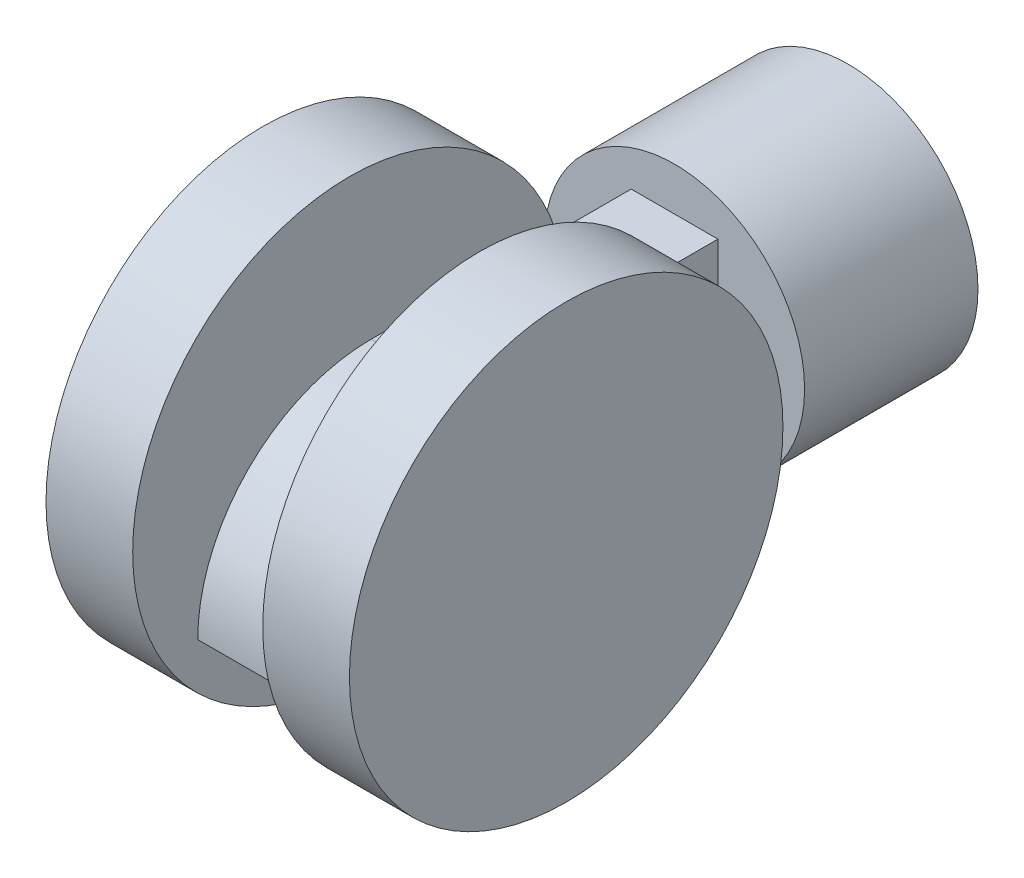
ISO-10303-21;
HEADER;
FILE_DESCRIPTION(('STEP AP214'),'2;1');
FILE_NAME('part.step','',(''),(''),'','','');
FILE_SCHEMA(('AUTOMOTIVE_DESIGN { 1 0 10303 214 1 1 1 1 }'));
ENDSEC;
DATA;
#1=APPLICATION_CONTEXT('core data for automotive mechanical design processes');
#2=APPLICATION_PROTOCOL_DEFINITION('international standard','automotive_design',2000,#1);
#3=PRODUCT_CONTEXT('',#1,'mechanical');
#4=PRODUCT('Part','Part','',(#3));
#5=PRODUCT_RELATED_PRODUCT_CATEGORY('part','',(#4));
#6=PRODUCT_DEFINITION_FORMATION('','',#4);
#7=PRODUCT_DEFINITION_CONTEXT('part definition',#1,'design');
#8=PRODUCT_DEFINITION('design','',#6,#7);
#9=PRODUCT_DEFINITION_SHAPE('','',#8);
#10=(LENGTH_UNIT() NAMED_UNIT(*) SI_UNIT(.MILLI.,.METRE.));
#11=(NAMED_UNIT(*) PLANE_ANGLE_UNIT() SI_UNIT($,.RADIAN.));
#12=(NAMED_UNIT(*) SI_UNIT($,.STERADIAN.) SOLID_ANGLE_UNIT());
#13=UNCERTAINTY_MEASURE_WITH_UNIT(LENGTH_MEASURE(1.E-05),#10,'distance_accuracy_value','');
#14=(GEOMETRIC_REPRESENTATION_CONTEXT(3) GLOBAL_UNCERTAINTY_ASSIGNED_CONTEXT((#13)) GLOBAL_UNIT_ASSIGNED_CONTEXT((#10,
#11,#12)) REPRESENTATION_CONTEXT('',''));
#15=CARTESIAN_POINT('',(0.,0.,0.));
#16=DIRECTION('',(0.,0.,1.));
#17=DIRECTION('',(1.,0.,0.));
#18=AXIS2_PLACEMENT_3D('',#15,#16,#17);
#19=CARTESIAN_POINT('',(1.,0.,14.));
#20=DIRECTION('',(-1.,0.,0.));
#21=DIRECTION('',(0.,0.,1.));
#22=AXIS2_PLACEMENT_3D('',#19,#20,#21);
#23=PLANE('',#22);
#24=DIRECTION('',(0.,0.,-1.));
#25=VECTOR('',#24,1.);
#26=CARTESIAN_POINT('',(1.,2.,14.));
#27=LINE('',#26,#25);
#28=CARTESIAN_POINT('',(1.,2.,10.));
#29=VERTEX_POINT('',#28);
#30=CARTESIAN_POINT('',(1.,2.,4.));
#31=VERTEX_POINT('',#30);
#32=EDGE_CURVE('E104',#29,#31,#27,.T.);
#33=ORIENTED_EDGE('',*,*,#32,.F.);
#34=CARTESIAN_POINT('',(1.,-2.,10.));
#35=DIRECTION('',(-1.,0.,0.));
#36=DIRECTION('',(0.,0.,1.));
#37=AXIS2_PLACEMENT_3D('',#34,#35,#36);
#38=CIRCLE('',#37,4.);
#39=CARTESIAN_POINT('',(1.,-2.,14.));
#40=VERTEX_POINT('',#39);
#41=EDGE_CURVE('E11',#29,#40,#38,.F.);
#42=ORIENTED_EDGE('',*,*,#41,.T.);
#43=DIRECTION('',(0.,0.,-1.));
#44=VECTOR('',#43,1.);
#45=CARTESIAN_POINT('',(1.,-2.,14.));
#46=LINE('',#45,#44);
#47=CARTESIAN_POINT('',(1.,-2.,4.));
#48=VERTEX_POINT('',#47);
#49=EDGE_CURVE('E90',#40,#48,#46,.T.);
#50=ORIENTED_EDGE('',*,*,#49,.T.);
#51=DIRECTION('',(0.,-1.,0.));
#52=VECTOR('',#51,1.);
#53=CARTESIAN_POINT('',(1.,0.,4.));
#54=LINE('',#53,#52);
#55=EDGE_CURVE('E112',#31,#48,#54,.T.);
#56=ORIENTED_EDGE('',*,*,#55,.F.);
#57=EDGE_LOOP('',(#33,#42,#50,#56));
#58=FACE_BOUND('',#57,.T.);
#59=CARTESIAN_POINT('',(1.,0.,10.));
#60=DIRECTION('',(-1.,0.,0.));
#61=DIRECTION('',(0.,0.,1.));
#62=AXIS2_PLACEMENT_3D('',#59,#60,#61);
#63=CIRCLE('',#62,1.);
#64=CARTESIAN_POINT('',(1.,0.,11.));
#65=VERTEX_POINT('',#64);
#66=EDGE_CURVE('E79',#65,#65,#63,.F.);
#67=ORIENTED_EDGE('',*,*,#66,.F.);
#68=EDGE_LOOP('',(#67));
#69=FACE_BOUND('',#68,.T.);
#70=ADVANCED_FACE('F38',(#58,#69),#23,.F.);
#71=CARTESIAN_POINT('',(-1.,2.,14.));
#72=DIRECTION('',(1.,0.,0.));
#73=DIRECTION('',(0.,1.,0.));
#74=AXIS2_PLACEMENT_3D('',#71,#72,#73);
#75=PLANE('',#74);
#76=DIRECTION('',(0.,0.,-1.));
#77=VECTOR('',#76,1.);
#78=CARTESIAN_POINT('',(-1.,-2.,14.));
#79=LINE('',#78,#77);
#80=CARTESIAN_POINT('',(-1.,-2.,14.));
#81=VERTEX_POINT('',#80);
#82=CARTESIAN_POINT('',(-1.,-2.,4.));
#83=VERTEX_POINT('',#82);
#84=EDGE_CURVE('E82',#81,#83,#79,.T.);
#85=ORIENTED_EDGE('',*,*,#84,.F.);
#86=CARTESIAN_POINT('',(-1.,-2.,10.));
#87=DIRECTION('',(1.,0.,0.));
#88=DIRECTION('',(0.,1.,0.));
#89=AXIS2_PLACEMENT_3D('',#86,#87,#88);
#90=CIRCLE('',#89,4.);
#91=CARTESIAN_POINT('',(-1.,2.,10.));
#92=VERTEX_POINT('',#91);
#93=EDGE_CURVE('E60',#81,#92,#90,.F.);
#94=ORIENTED_EDGE('',*,*,#93,.T.);
#95=DIRECTION('',(0.,0.,-1.));
#96=VECTOR('',#95,1.);
#97=CARTESIAN_POINT('',(-1.,2.,14.));
#98=LINE('',#97,#96);
#99=CARTESIAN_POINT('',(-1.,2.,4.));
#100=VERTEX_POINT('',#99);
#101=EDGE_CURVE('E89',#92,#100,#98,.T.);
#102=ORIENTED_EDGE('',*,*,#101,.T.);
#103=DIRECTION('',(0.,1.,0.));
#104=VECTOR('',#103,1.);
#105=CARTESIAN_POINT('',(-1.,0.,4.));
#106=LINE('',#105,#104);
#107=EDGE_CURVE('E86',#83,#100,#106,.T.);
#108=ORIENTED_EDGE('',*,*,#107,.F.);
#109=EDGE_LOOP('',(#85,#94,#102,#108));
#110=FACE_BOUND('',#109,.T.);
#111=CARTESIAN_POINT('',(-1.,0.,10.));
#112=DIRECTION('',(1.,0.,0.));
#113=DIRECTION('',(0.,1.,0.));
#114=AXIS2_PLACEMENT_3D('',#111,#112,#113);
#115=CIRCLE('',#114,1.);
#116=CARTESIAN_POINT('',(-1.,0.999999999999999,10.));
#117=VERTEX_POINT('',#116);
#118=EDGE_CURVE('E119',#117,#117,#115,.F.);
#119=ORIENTED_EDGE('',*,*,#118,.F.);
#120=EDGE_LOOP('',(#119));
#121=FACE_BOUND('',#120,.T.);
#122=ADVANCED_FACE('F83',(#110,#121),#75,.F.);
#123=CARTESIAN_POINT('',(0.,0.,4.));
#124=DIRECTION('',(0.,0.,1.));
#125=DIRECTION('',(1.,0.,0.));
#126=AXIS2_PLACEMENT_3D('',#123,#124,#125);
#127=PLANE('',#126);
#128=CARTESIAN_POINT('',(0.,0.,4.));
#129=DIRECTION('',(0.,0.,1.));
#130=DIRECTION('',(1.,0.,0.));
#131=AXIS2_PLACEMENT_3D('',#128,#129,#130);
#132=CIRCLE('',#131,3.);
#133=CARTESIAN_POINT('',(3.,0.,4.));
#134=VERTEX_POINT('',#133);
#135=EDGE_CURVE('E116',#134,#134,#132,.T.);
#136=ORIENTED_EDGE('',*,*,#135,.T.);
#137=EDGE_LOOP('',(#136));
#138=FACE_BOUND('',#137,.T.);
#139=DIRECTION('',(1.,0.,0.));
#140=VECTOR('',#139,1.);
#141=CARTESIAN_POINT('',(0.,2.,4.));
#142=LINE('',#141,#140);
#143=EDGE_CURVE('E109',#100,#31,#142,.T.);
#144=ORIENTED_EDGE('',*,*,#143,.T.);
#145=ORIENTED_EDGE('',*,*,#55,.T.);
#146=DIRECTION('',(-1.,0.,0.));
#147=VECTOR('',#146,1.);
#148=CARTESIAN_POINT('',(0.,-2.,4.));
#149=LINE('',#148,#147);
#150=EDGE_CURVE('E106',#48,#83,#149,.T.);
#151=ORIENTED_EDGE('',*,*,#150,.T.);
#152=ORIENTED_EDGE('',*,*,#107,.T.);
#153=EDGE_LOOP('',(#144,#145,#151,#152));
#154=FACE_BOUND('',#153,.T.);
#155=ADVANCED_FACE('F136',(#138,#154),#127,.T.);
#156=CARTESIAN_POINT('',(0.,0.,4.));
#157=DIRECTION('',(0.,0.,-1.));
#158=DIRECTION('',(-1.,0.,0.));
#159=AXIS2_PLACEMENT_3D('',#156,#157,#158);
#160=CYLINDRICAL_SURFACE('',#159,3.);
#161=ORIENTED_EDGE('',*,*,#135,.F.);
#162=EDGE_LOOP('',(#161));
#163=FACE_BOUND('',#162,.T.);
#164=CARTESIAN_POINT('',(0.,0.,0.));
#165=DIRECTION('',(0.,0.,1.));
#166=DIRECTION('',(1.,0.,0.));
#167=AXIS2_PLACEMENT_3D('',#164,#165,#166);
#168=CIRCLE('',#167,3.);
#169=CARTESIAN_POINT('',(3.,0.,0.));
#170=VERTEX_POINT('',#169);
#171=EDGE_CURVE('E115',#170,#170,#168,.T.);
#172=ORIENTED_EDGE('',*,*,#171,.T.);
#173=EDGE_LOOP('',(#172));
#174=FACE_BOUND('',#173,.T.);
#175=ADVANCED_FACE('F143',(#163,#174),#160,.T.);
#176=CARTESIAN_POINT('',(0.,0.,0.));
#177=DIRECTION('',(0.,0.,1.));
#178=DIRECTION('',(1.,0.,0.));
#179=AXIS2_PLACEMENT_3D('',#176,#177,#178);
#180=PLANE('',#179);
#181=ORIENTED_EDGE('',*,*,#171,.F.);
#182=EDGE_LOOP('',(#181));
#183=FACE_BOUND('',#182,.T.);
#184=ADVANCED_FACE('F145',(#183),#180,.F.);
#185=CARTESIAN_POINT('',(1.,2.,14.));
#186=DIRECTION('',(0.,-1.,0.));
#187=DIRECTION('',(1.,0.,0.));
#188=AXIS2_PLACEMENT_3D('',#185,#186,#187);
#189=PLANE('',#188);
#190=ORIENTED_EDGE('',*,*,#101,.F.);
#191=DIRECTION('',(-1.,0.,0.));
#192=VECTOR('',#191,1.);
#193=CARTESIAN_POINT('',(1.,2.,10.));
#194=LINE('',#193,#192);
#195=EDGE_CURVE('E46',#92,#29,#194,.F.);
#196=ORIENTED_EDGE('',*,*,#195,.T.);
#197=ORIENTED_EDGE('',*,*,#32,.T.);
#198=ORIENTED_EDGE('',*,*,#143,.F.);
#199=EDGE_LOOP('',(#190,#196,#197,#198));
#200=FACE_BOUND('',#199,.T.);
#201=ADVANCED_FACE('F140',(#200),#189,.F.);
#202=CARTESIAN_POINT('',(-1.,-2.,14.));
#203=DIRECTION('',(0.,1.,0.));
#204=DIRECTION('',(0.,0.,1.));
#205=AXIS2_PLACEMENT_3D('',#202,#203,#204);
#206=PLANE('',#205);
#207=ORIENTED_EDGE('',*,*,#150,.F.);
#208=ORIENTED_EDGE('',*,*,#49,.F.);
#209=DIRECTION('',(1.,0.,0.));
#210=VECTOR('',#209,1.);
#211=CARTESIAN_POINT('',(-1.,-2.,14.));
#212=LINE('',#211,#210);
#213=EDGE_CURVE('E78',#81,#40,#212,.T.);
#214=ORIENTED_EDGE('',*,*,#213,.F.);
#215=ORIENTED_EDGE('',*,*,#84,.T.);
#216=EDGE_LOOP('',(#207,#208,#214,#215));
#217=FACE_BOUND('',#216,.T.);
#218=ADVANCED_FACE('F93',(#217),#206,.F.);
#219=CARTESIAN_POINT('',(1.5,0.,10.));
#220=DIRECTION('',(-1.,0.,0.));
#221=DIRECTION('',(0.,0.,1.));
#222=AXIS2_PLACEMENT_3D('',#219,#220,#221);
#223=CYLINDRICAL_SURFACE('',#222,1.);
#224=CARTESIAN_POINT('',(-1.5,0.,10.));
#225=DIRECTION('',(-1.,0.,0.));
#226=DIRECTION('',(0.,0.,1.));
#227=AXIS2_PLACEMENT_3D('',#224,#225,#226);
#228=CIRCLE('',#227,1.);
#229=CARTESIAN_POINT('',(-1.5,0.,11.));
#230=VERTEX_POINT('',#229);
#231=EDGE_CURVE('E99',#230,#230,#228,.T.);
#232=ORIENTED_EDGE('',*,*,#231,.F.);
#233=EDGE_LOOP('',(#232));
#234=FACE_BOUND('',#233,.T.);
#235=ORIENTED_EDGE('',*,*,#118,.T.);
#236=EDGE_LOOP('',(#235));
#237=FACE_BOUND('',#236,.T.);
#238=ADVANCED_FACE('F162',(#234,#237),#223,.T.);
#239=CARTESIAN_POINT('',(1.5,0.,10.));
#240=DIRECTION('',(1.,0.,0.));
#241=DIRECTION('',(0.,0.,-1.));
#242=AXIS2_PLACEMENT_3D('',#239,#240,#241);
#243=CIRCLE('',#242,1.);
#244=CARTESIAN_POINT('',(1.5,0.,9.));
#245=VERTEX_POINT('',#244);
#246=EDGE_CURVE('E95',#245,#245,#243,.T.);
#247=ORIENTED_EDGE('',*,*,#246,.F.);
#248=EDGE_LOOP('',(#247));
#249=FACE_BOUND('',#248,.T.);
#250=ORIENTED_EDGE('',*,*,#66,.T.);
#251=EDGE_LOOP('',(#250));
#252=FACE_BOUND('',#251,.T.);
#253=ADVANCED_FACE('F128',(#249,#252),#223,.T.);
#254=CARTESIAN_POINT('',(-1.5,0.,10.));
#255=DIRECTION('',(-1.,0.,0.));
#256=DIRECTION('',(0.,0.,1.));
#257=AXIS2_PLACEMENT_3D('',#254,#255,#256);
#258=PLANE('',#257);
#259=CARTESIAN_POINT('',(-1.5,0.,10.));
#260=DIRECTION('',(-1.,0.,0.));
#261=DIRECTION('',(0.,0.,1.));
#262=AXIS2_PLACEMENT_3D('',#259,#260,#261);
#263=CIRCLE('',#262,5.);
#264=CARTESIAN_POINT('',(-1.5,0.,15.));
#265=VERTEX_POINT('',#264);
#266=EDGE_CURVE('E201',#265,#265,#263,.T.);
#267=ORIENTED_EDGE('',*,*,#266,.F.);
#268=EDGE_LOOP('',(#267));
#269=FACE_BOUND('',#268,.T.);
#270=ORIENTED_EDGE('',*,*,#231,.T.);
#271=EDGE_LOOP('',(#270));
#272=FACE_BOUND('',#271,.T.);
#273=ADVANCED_FACE('F171',(#269,#272),#258,.F.);
#274=CARTESIAN_POINT('',(-3.5,0.,10.));
#275=DIRECTION('',(1.,0.,0.));
#276=DIRECTION('',(0.,0.,-1.));
#277=AXIS2_PLACEMENT_3D('',#274,#275,#276);
#278=CYLINDRICAL_SURFACE('',#277,5.);
#279=CARTESIAN_POINT('',(-3.5,0.,10.));
#280=DIRECTION('',(-1.,0.,0.));
#281=DIRECTION('',(0.,0.,1.));
#282=AXIS2_PLACEMENT_3D('',#279,#280,#281);
#283=CIRCLE('',#282,5.);
#284=CARTESIAN_POINT('',(-3.5,0.,15.));
#285=VERTEX_POINT('',#284);
#286=EDGE_CURVE('E205',#285,#285,#283,.T.);
#287=ORIENTED_EDGE('',*,*,#286,.F.);
#288=EDGE_LOOP('',(#287));
#289=FACE_BOUND('',#288,.T.);
#290=ORIENTED_EDGE('',*,*,#266,.T.);
#291=EDGE_LOOP('',(#290));
#292=FACE_BOUND('',#291,.T.);
#293=ADVANCED_FACE('F173',(#289,#292),#278,.T.);
#294=CARTESIAN_POINT('',(-3.5,0.,10.));
#295=DIRECTION('',(-1.,0.,0.));
#296=DIRECTION('',(0.,0.,1.));
#297=AXIS2_PLACEMENT_3D('',#294,#295,#296);
#298=PLANE('',#297);
#299=ORIENTED_EDGE('',*,*,#286,.T.);
#300=EDGE_LOOP('',(#299));
#301=FACE_BOUND('',#300,.T.);
#302=ADVANCED_FACE('F176',(#301),#298,.T.);
#303=CARTESIAN_POINT('',(1.5,0.,10.));
#304=DIRECTION('',(1.,0.,0.));
#305=DIRECTION('',(0.,0.,-1.));
#306=AXIS2_PLACEMENT_3D('',#303,#304,#305);
#307=PLANE('',#306);
#308=CARTESIAN_POINT('',(1.5,0.,10.));
#309=DIRECTION('',(1.,0.,0.));
#310=DIRECTION('',(0.,0.,-1.));
#311=AXIS2_PLACEMENT_3D('',#308,#309,#310);
#312=CIRCLE('',#311,5.);
#313=CARTESIAN_POINT('',(1.5,0.,5.));
#314=VERTEX_POINT('',#313);
#315=EDGE_CURVE('E202',#314,#314,#312,.T.);
#316=ORIENTED_EDGE('',*,*,#315,.F.);
#317=EDGE_LOOP('',(#316));
#318=FACE_BOUND('',#317,.T.);
#319=ORIENTED_EDGE('',*,*,#246,.T.);
#320=EDGE_LOOP('',(#319));
#321=FACE_BOUND('',#320,.T.);
#322=ADVANCED_FACE('F183',(#318,#321),#307,.F.);
#323=CARTESIAN_POINT('',(3.5,0.,10.));
#324=DIRECTION('',(-1.,0.,0.));
#325=DIRECTION('',(0.,0.,1.));
#326=AXIS2_PLACEMENT_3D('',#323,#324,#325);
#327=CYLINDRICAL_SURFACE('',#326,5.);
#328=CARTESIAN_POINT('',(3.5,0.,10.));
#329=DIRECTION('',(1.,0.,0.));
#330=DIRECTION('',(0.,0.,-1.));
#331=AXIS2_PLACEMENT_3D('',#328,#329,#330);
#332=CIRCLE('',#331,5.);
#333=CARTESIAN_POINT('',(3.5,0.,5.));
#334=VERTEX_POINT('',#333);
#335=EDGE_CURVE('E200',#334,#334,#332,.T.);
#336=ORIENTED_EDGE('',*,*,#335,.F.);
#337=EDGE_LOOP('',(#336));
#338=FACE_BOUND('',#337,.T.);
#339=ORIENTED_EDGE('',*,*,#315,.T.);
#340=EDGE_LOOP('',(#339));
#341=FACE_BOUND('',#340,.T.);
#342=ADVANCED_FACE('F185',(#338,#341),#327,.T.);
#343=CARTESIAN_POINT('',(3.5,0.,10.));
#344=DIRECTION('',(1.,0.,0.));
#345=DIRECTION('',(0.,0.,-1.));
#346=AXIS2_PLACEMENT_3D('',#343,#344,#345);
#347=PLANE('',#346);
#348=ORIENTED_EDGE('',*,*,#335,.T.);
#349=EDGE_LOOP('',(#348));
#350=FACE_BOUND('',#349,.T.);
#351=ADVANCED_FACE('F188',(#350),#347,.T.);
#352=CARTESIAN_POINT('',(1.,-2.,10.));
#353=DIRECTION('',(1.,0.,0.));
#354=DIRECTION('',(0.,1.,0.));
#355=AXIS2_PLACEMENT_3D('',#352,#353,#354);
#356=CYLINDRICAL_SURFACE('',#355,4.);
#357=ORIENTED_EDGE('',*,*,#41,.F.);
#358=ORIENTED_EDGE('',*,*,#195,.F.);
#359=ORIENTED_EDGE('',*,*,#93,.F.);
#360=ORIENTED_EDGE('',*,*,#213,.T.);
#361=EDGE_LOOP('',(#357,#358,#359,#360));
#362=FACE_BOUND('',#361,.T.);
#363=ADVANCED_FACE('F40',(#362),#356,.T.);
#364=CLOSED_SHELL('',(#70,#122,#155,#175,#184,#201,#218,#238,#253,#273,#293,#302,#322,#342,#351,#363));
#365=MANIFOLD_SOLID_BREP('B2',#364);
#366=ADVANCED_BREP_SHAPE_REPRESENTATION('',(#18,#365),#14);
#367=SHAPE_DEFINITION_REPRESENTATION(#9,#366);
ENDSEC;
END-ISO-10303-21;
